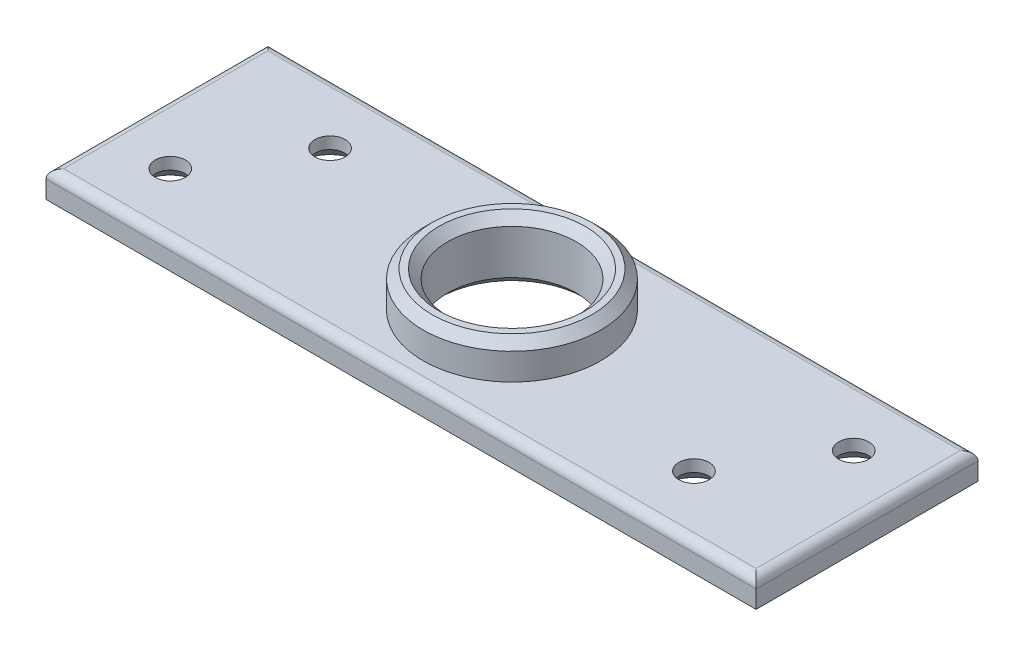
ISO-10303-21;
HEADER;
FILE_DESCRIPTION(('STEP AP214'),'2;1');
FILE_NAME('part.step','',(''),(''),'','','');
FILE_SCHEMA(('AUTOMOTIVE_DESIGN { 1 0 10303 214 1 1 1 1 }'));
ENDSEC;
DATA;
#1=APPLICATION_CONTEXT('core data for automotive mechanical design processes');
#2=APPLICATION_PROTOCOL_DEFINITION('international standard','automotive_design',2000,#1);
#3=PRODUCT_CONTEXT('',#1,'mechanical');
#4=PRODUCT('Part','Part','',(#3));
#5=PRODUCT_RELATED_PRODUCT_CATEGORY('part','',(#4));
#6=PRODUCT_DEFINITION_FORMATION('','',#4);
#7=PRODUCT_DEFINITION_CONTEXT('part definition',#1,'design');
#8=PRODUCT_DEFINITION('design','',#6,#7);
#9=PRODUCT_DEFINITION_SHAPE('','',#8);
#10=(LENGTH_UNIT() NAMED_UNIT(*) SI_UNIT(.MILLI.,.METRE.));
#11=(NAMED_UNIT(*) PLANE_ANGLE_UNIT() SI_UNIT($,.RADIAN.));
#12=(NAMED_UNIT(*) SI_UNIT($,.STERADIAN.) SOLID_ANGLE_UNIT());
#13=UNCERTAINTY_MEASURE_WITH_UNIT(LENGTH_MEASURE(1.E-05),#10,'distance_accuracy_value','');
#14=(GEOMETRIC_REPRESENTATION_CONTEXT(3) GLOBAL_UNCERTAINTY_ASSIGNED_CONTEXT((#13)) GLOBAL_UNIT_ASSIGNED_CONTEXT((#10,
#11,#12)) REPRESENTATION_CONTEXT('',''));
#15=CARTESIAN_POINT('',(0.,0.,0.));
#16=DIRECTION('',(0.,0.,1.));
#17=DIRECTION('',(1.,0.,0.));
#18=AXIS2_PLACEMENT_3D('',#15,#16,#17);
#19=CARTESIAN_POINT('',(0.,37.7842712474619,0.));
#20=DIRECTION('',(0.,-1.,0.));
#21=DIRECTION('',(0.,0.,-1.));
#22=AXIS2_PLACEMENT_3D('',#19,#20,#21);
#23=CYLINDRICAL_SURFACE('',#22,10.);
#24=CARTESIAN_POINT('',(0.,4.5,0.));
#25=DIRECTION('',(0.,-1.,0.));
#26=DIRECTION('',(0.,0.,-1.));
#27=AXIS2_PLACEMENT_3D('',#24,#25,#26);
#28=CIRCLE('',#27,10.);
#29=CARTESIAN_POINT('',(0.,4.5,-10.));
#30=VERTEX_POINT('',#29);
#31=EDGE_CURVE('E62',#30,#30,#28,.T.);
#32=ORIENTED_EDGE('',*,*,#31,.T.);
#33=EDGE_LOOP('',(#32));
#34=FACE_BOUND('',#33,.T.);
#35=CARTESIAN_POINT('',(0.,-0.5,0.));
#36=DIRECTION('',(0.,-1.,0.));
#37=DIRECTION('',(0.,0.,-1.));
#38=AXIS2_PLACEMENT_3D('',#35,#36,#37);
#39=CIRCLE('',#38,10.);
#40=CARTESIAN_POINT('',(0.,-0.5,-10.));
#41=VERTEX_POINT('',#40);
#42=EDGE_CURVE('E66',#41,#41,#39,.F.);
#43=ORIENTED_EDGE('',*,*,#42,.T.);
#44=EDGE_LOOP('',(#43));
#45=FACE_BOUND('',#44,.T.);
#46=ADVANCED_FACE('F50',(#34,#45),#23,.T.);
#47=CARTESIAN_POINT('',(0.,-1.5,0.));
#48=DIRECTION('',(0.,-1.,0.));
#49=DIRECTION('',(0.,0.,-1.));
#50=AXIS2_PLACEMENT_3D('',#47,#48,#49);
#51=PLANE('',#50);
#52=CARTESIAN_POINT('',(0.,-1.5,0.));
#53=DIRECTION('',(0.,-1.,0.));
#54=DIRECTION('',(0.,0.,-1.));
#55=AXIS2_PLACEMENT_3D('',#52,#53,#54);
#56=CIRCLE('',#55,9.00000000000001);
#57=CARTESIAN_POINT('',(0.,-1.5,-9.00000000000001));
#58=VERTEX_POINT('',#57);
#59=EDGE_CURVE('E11',#58,#58,#56,.T.);
#60=ORIENTED_EDGE('',*,*,#59,.T.);
#61=EDGE_LOOP('',(#60));
#62=FACE_BOUND('',#61,.T.);
#63=CARTESIAN_POINT('',(0.,-1.5,0.));
#64=DIRECTION('',(0.,-1.,0.));
#65=DIRECTION('',(0.,0.,-1.));
#66=AXIS2_PLACEMENT_3D('',#63,#64,#65);
#67=CIRCLE('',#66,8.24999999999999);
#68=CARTESIAN_POINT('',(0.,-1.5,-8.24999999999999));
#69=VERTEX_POINT('',#68);
#70=EDGE_CURVE('E58',#69,#69,#67,.F.);
#71=ORIENTED_EDGE('',*,*,#70,.T.);
#72=EDGE_LOOP('',(#71));
#73=FACE_BOUND('',#72,.T.);
#74=ADVANCED_FACE('F95',(#62,#73),#51,.T.);
#75=CARTESIAN_POINT('',(0.,37.7842712474619,0.));
#76=DIRECTION('',(0.,-1.,0.));
#77=DIRECTION('',(0.,0.,-1.));
#78=AXIS2_PLACEMENT_3D('',#75,#76,#77);
#79=CYLINDRICAL_SURFACE('',#78,7.25);
#80=CARTESIAN_POINT('',(0.,4.5,0.));
#81=DIRECTION('',(0.,-1.,0.));
#82=DIRECTION('',(0.,0.,-1.));
#83=AXIS2_PLACEMENT_3D('',#80,#81,#82);
#84=CIRCLE('',#83,7.25);
#85=CARTESIAN_POINT('',(0.,4.5,-7.25));
#86=VERTEX_POINT('',#85);
#87=EDGE_CURVE('E77',#86,#86,#84,.F.);
#88=ORIENTED_EDGE('',*,*,#87,.T.);
#89=EDGE_LOOP('',(#88));
#90=FACE_BOUND('',#89,.T.);
#91=CARTESIAN_POINT('',(0.,-0.500000000000014,0.));
#92=DIRECTION('',(0.,-1.,0.));
#93=DIRECTION('',(0.,0.,-1.));
#94=AXIS2_PLACEMENT_3D('',#91,#92,#93);
#95=CIRCLE('',#94,7.25);
#96=CARTESIAN_POINT('',(0.,-0.500000000000014,-7.25));
#97=VERTEX_POINT('',#96);
#98=EDGE_CURVE('E80',#97,#97,#95,.T.);
#99=ORIENTED_EDGE('',*,*,#98,.T.);
#100=EDGE_LOOP('',(#99));
#101=FACE_BOUND('',#100,.T.);
#102=ADVANCED_FACE('F84',(#90,#101),#79,.F.);
#103=CARTESIAN_POINT('',(0.,5.5,0.));
#104=DIRECTION('',(0.,-1.,0.));
#105=DIRECTION('',(0.,0.,-1.));
#106=AXIS2_PLACEMENT_3D('',#103,#104,#105);
#107=PLANE('',#106);
#108=CARTESIAN_POINT('',(0.,5.5,0.));
#109=DIRECTION('',(0.,-1.,0.));
#110=DIRECTION('',(0.,0.,-1.));
#111=AXIS2_PLACEMENT_3D('',#108,#109,#110);
#112=CIRCLE('',#111,8.25000000000001);
#113=CARTESIAN_POINT('',(0.,5.5,-8.25000000000001));
#114=VERTEX_POINT('',#113);
#115=EDGE_CURVE('E71',#114,#114,#112,.T.);
#116=ORIENTED_EDGE('',*,*,#115,.T.);
#117=EDGE_LOOP('',(#116));
#118=FACE_BOUND('',#117,.T.);
#119=CARTESIAN_POINT('',(0.,5.5,0.));
#120=DIRECTION('',(0.,-1.,0.));
#121=DIRECTION('',(0.,0.,-1.));
#122=AXIS2_PLACEMENT_3D('',#119,#120,#121);
#123=CIRCLE('',#122,9.);
#124=CARTESIAN_POINT('',(0.,5.5,-9.));
#125=VERTEX_POINT('',#124);
#126=EDGE_CURVE('E74',#125,#125,#123,.F.);
#127=ORIENTED_EDGE('',*,*,#126,.T.);
#128=EDGE_LOOP('',(#127));
#129=FACE_BOUND('',#128,.T.);
#130=ADVANCED_FACE('F112',(#118,#129),#107,.F.);
#131=CARTESIAN_POINT('',(0.,4.5,0.));
#132=DIRECTION('',(0.,1.,0.));
#133=DIRECTION('',(0.,0.,1.));
#134=AXIS2_PLACEMENT_3D('',#131,#132,#133);
#135=CONICAL_SURFACE('',#134,7.25,0.785398163397451);
#136=ORIENTED_EDGE('',*,*,#115,.F.);
#137=EDGE_LOOP('',(#136));
#138=FACE_BOUND('',#137,.T.);
#139=ORIENTED_EDGE('',*,*,#87,.F.);
#140=EDGE_LOOP('',(#139));
#141=FACE_BOUND('',#140,.T.);
#142=ADVANCED_FACE('F106',(#138,#141),#135,.F.);
#143=CARTESIAN_POINT('',(0.,5.5,0.));
#144=DIRECTION('',(0.,-1.,0.));
#145=DIRECTION('',(0.,0.,-1.));
#146=AXIS2_PLACEMENT_3D('',#143,#144,#145);
#147=CONICAL_SURFACE('',#146,9.00000000000001,0.785398163397446);
#148=ORIENTED_EDGE('',*,*,#31,.F.);
#149=EDGE_LOOP('',(#148));
#150=FACE_BOUND('',#149,.T.);
#151=ORIENTED_EDGE('',*,*,#126,.F.);
#152=EDGE_LOOP('',(#151));
#153=FACE_BOUND('',#152,.T.);
#154=ADVANCED_FACE('F92',(#150,#153),#147,.T.);
#155=CARTESIAN_POINT('',(0.,-1.5,0.));
#156=DIRECTION('',(0.,1.,0.));
#157=DIRECTION('',(0.,0.,1.));
#158=AXIS2_PLACEMENT_3D('',#155,#156,#157);
#159=CONICAL_SURFACE('',#158,9.00000000000001,0.785398163397446);
#160=ORIENTED_EDGE('',*,*,#42,.F.);
#161=EDGE_LOOP('',(#160));
#162=FACE_BOUND('',#161,.T.);
#163=ORIENTED_EDGE('',*,*,#59,.F.);
#164=EDGE_LOOP('',(#163));
#165=FACE_BOUND('',#164,.T.);
#166=ADVANCED_FACE('F87',(#162,#165),#159,.T.);
#167=CARTESIAN_POINT('',(0.,-0.500000000000014,0.));
#168=DIRECTION('',(0.,-1.,0.));
#169=DIRECTION('',(0.,0.,-1.));
#170=AXIS2_PLACEMENT_3D('',#167,#168,#169);
#171=CONICAL_SURFACE('',#170,7.25,0.78539816339745);
#172=ORIENTED_EDGE('',*,*,#70,.F.);
#173=EDGE_LOOP('',(#172));
#174=FACE_BOUND('',#173,.T.);
#175=ORIENTED_EDGE('',*,*,#98,.F.);
#176=EDGE_LOOP('',(#175));
#177=FACE_BOUND('',#176,.T.);
#178=ADVANCED_FACE('F53',(#174,#177),#171,.F.);
#179=CLOSED_SHELL('',(#46,#74,#102,#130,#142,#154,#166,#178));
#180=MANIFOLD_SOLID_BREP('B2',#179);
#181=CARTESIAN_POINT('',(0.,1.5,0.));
#182=DIRECTION('',(0.,-1.,0.));
#183=DIRECTION('',(0.,0.,-1.));
#184=AXIS2_PLACEMENT_3D('',#181,#182,#183);
#185=PLANE('',#184);
#186=CARTESIAN_POINT('',(32.9999999999999,1.5,-5.50000000000353));
#187=DIRECTION('',(0.,-1.,0.));
#188=DIRECTION('',(0.,0.,-1.));
#189=AXIS2_PLACEMENT_3D('',#186,#187,#188);
#190=CIRCLE('',#189,1.7);
#191=CARTESIAN_POINT('',(32.9999999999999,1.5,-7.20000000000353));
#192=VERTEX_POINT('',#191);
#193=EDGE_CURVE('E204',#192,#192,#190,.T.);
#194=ORIENTED_EDGE('',*,*,#193,.T.);
#195=EDGE_LOOP('',(#194));
#196=FACE_BOUND('',#195,.T.);
#197=CARTESIAN_POINT('',(25.9999999999999,1.5,5.49999999999647));
#198=DIRECTION('',(0.,-1.,0.));
#199=DIRECTION('',(0.,0.,-1.));
#200=AXIS2_PLACEMENT_3D('',#197,#198,#199);
#201=CIRCLE('',#200,1.7);
#202=CARTESIAN_POINT('',(25.9999999999999,1.5,3.79999999999647));
#203=VERTEX_POINT('',#202);
#204=EDGE_CURVE('E318',#203,#203,#201,.T.);
#205=ORIENTED_EDGE('',*,*,#204,.T.);
#206=EDGE_LOOP('',(#205));
#207=FACE_BOUND('',#206,.T.);
#208=CARTESIAN_POINT('',(-26.0000000000001,1.5,-5.50000000000354));
#209=DIRECTION('',(0.,-1.,0.));
#210=DIRECTION('',(0.,0.,-1.));
#211=AXIS2_PLACEMENT_3D('',#208,#209,#210);
#212=CIRCLE('',#211,1.7);
#213=CARTESIAN_POINT('',(-26.0000000000001,1.5,-7.20000000000354));
#214=VERTEX_POINT('',#213);
#215=EDGE_CURVE('E314',#214,#214,#212,.T.);
#216=ORIENTED_EDGE('',*,*,#215,.T.);
#217=EDGE_LOOP('',(#216));
#218=FACE_BOUND('',#217,.T.);
#219=CARTESIAN_POINT('',(-33.0000000000001,1.5,5.49999999999645));
#220=DIRECTION('',(0.,-1.,0.));
#221=DIRECTION('',(0.,0.,-1.));
#222=AXIS2_PLACEMENT_3D('',#219,#220,#221);
#223=CIRCLE('',#222,1.7);
#224=CARTESIAN_POINT('',(-33.0000000000001,1.5,3.79999999999645));
#225=VERTEX_POINT('',#224);
#226=EDGE_CURVE('E303',#225,#225,#223,.T.);
#227=ORIENTED_EDGE('',*,*,#226,.T.);
#228=EDGE_LOOP('',(#227));
#229=FACE_BOUND('',#228,.T.);
#230=DIRECTION('',(-1.,0.,0.));
#231=VECTOR('',#230,1.);
#232=CARTESIAN_POINT('',(0.,1.5,-11.5));
#233=LINE('',#232,#231);
#234=CARTESIAN_POINT('',(39.,1.5,-11.5));
#235=VERTEX_POINT('',#234);
#236=CARTESIAN_POINT('',(-39.,1.5,-11.5));
#237=VERTEX_POINT('',#236);
#238=EDGE_CURVE('E290',#235,#237,#233,.T.);
#239=ORIENTED_EDGE('',*,*,#238,.T.);
#240=DIRECTION('',(0.,0.,1.));
#241=VECTOR('',#240,1.);
#242=CARTESIAN_POINT('',(-39.,1.5,0.));
#243=LINE('',#242,#241);
#244=CARTESIAN_POINT('',(-39.,1.5,11.5));
#245=VERTEX_POINT('',#244);
#246=EDGE_CURVE('E292',#237,#245,#243,.T.);
#247=ORIENTED_EDGE('',*,*,#246,.T.);
#248=DIRECTION('',(1.,0.,0.));
#249=VECTOR('',#248,1.);
#250=CARTESIAN_POINT('',(0.,1.5,11.5));
#251=LINE('',#250,#249);
#252=CARTESIAN_POINT('',(39.,1.5,11.5));
#253=VERTEX_POINT('',#252);
#254=EDGE_CURVE('E258',#245,#253,#251,.T.);
#255=ORIENTED_EDGE('',*,*,#254,.T.);
#256=DIRECTION('',(0.,0.,-1.));
#257=VECTOR('',#256,1.);
#258=CARTESIAN_POINT('',(39.,1.5,0.));
#259=LINE('',#258,#257);
#260=EDGE_CURVE('E288',#253,#235,#259,.T.);
#261=ORIENTED_EDGE('',*,*,#260,.T.);
#262=EDGE_LOOP('',(#239,#247,#255,#261));
#263=FACE_BOUND('',#262,.T.);
#264=CARTESIAN_POINT('',(0.,1.5,0.));
#265=DIRECTION('',(0.,1.,0.));
#266=DIRECTION('',(0.,0.,1.));
#267=AXIS2_PLACEMENT_3D('',#264,#265,#266);
#268=CIRCLE('',#267,10.);
#269=CARTESIAN_POINT('',(0.,1.5,10.));
#270=VERTEX_POINT('',#269);
#271=EDGE_CURVE('E273',#270,#270,#268,.T.);
#272=ORIENTED_EDGE('',*,*,#271,.F.);
#273=EDGE_LOOP('',(#272));
#274=FACE_BOUND('',#273,.T.);
#275=ADVANCED_FACE('F200',(#196,#207,#218,#229,#263,#274),#185,.F.);
#276=CARTESIAN_POINT('',(0.,-1.5,0.));
#277=DIRECTION('',(0.,-1.,0.));
#278=DIRECTION('',(0.,0.,-1.));
#279=AXIS2_PLACEMENT_3D('',#276,#277,#278);
#280=PLANE('',#279);
#281=CARTESIAN_POINT('',(32.9999999999999,-1.5,-5.50000000000353));
#282=DIRECTION('',(0.,-1.,0.));
#283=DIRECTION('',(0.,0.,-1.));
#284=AXIS2_PLACEMENT_3D('',#281,#282,#283);
#285=CIRCLE('',#284,3.36);
#286=CARTESIAN_POINT('',(32.9999999999999,-1.5,-8.86000000000353));
#287=VERTEX_POINT('',#286);
#288=EDGE_CURVE('E443',#287,#287,#285,.T.);
#289=ORIENTED_EDGE('',*,*,#288,.F.);
#290=EDGE_LOOP('',(#289));
#291=FACE_BOUND('',#290,.T.);
#292=CARTESIAN_POINT('',(25.9999999999999,-1.5,5.49999999999647));
#293=DIRECTION('',(0.,-1.,0.));
#294=DIRECTION('',(0.,0.,-1.));
#295=AXIS2_PLACEMENT_3D('',#292,#293,#294);
#296=CIRCLE('',#295,3.36);
#297=CARTESIAN_POINT('',(25.9999999999999,-1.5,2.13999999999647));
#298=VERTEX_POINT('',#297);
#299=EDGE_CURVE('E327',#298,#298,#296,.T.);
#300=ORIENTED_EDGE('',*,*,#299,.F.);
#301=EDGE_LOOP('',(#300));
#302=FACE_BOUND('',#301,.T.);
#303=CARTESIAN_POINT('',(-26.0000000000001,-1.5,-5.50000000000354));
#304=DIRECTION('',(0.,-1.,0.));
#305=DIRECTION('',(0.,0.,-1.));
#306=AXIS2_PLACEMENT_3D('',#303,#304,#305);
#307=CIRCLE('',#306,3.36);
#308=CARTESIAN_POINT('',(-26.0000000000001,-1.5,-8.86000000000355));
#309=VERTEX_POINT('',#308);
#310=EDGE_CURVE('E320',#309,#309,#307,.T.);
#311=ORIENTED_EDGE('',*,*,#310,.F.);
#312=EDGE_LOOP('',(#311));
#313=FACE_BOUND('',#312,.T.);
#314=CARTESIAN_POINT('',(-33.0000000000001,-1.5,5.49999999999645));
#315=DIRECTION('',(0.,-1.,0.));
#316=DIRECTION('',(0.,0.,-1.));
#317=AXIS2_PLACEMENT_3D('',#314,#315,#316);
#318=CIRCLE('',#317,3.36);
#319=CARTESIAN_POINT('',(-33.0000000000001,-1.5,2.13999999999645));
#320=VERTEX_POINT('',#319);
#321=EDGE_CURVE('E316',#320,#320,#318,.T.);
#322=ORIENTED_EDGE('',*,*,#321,.F.);
#323=EDGE_LOOP('',(#322));
#324=FACE_BOUND('',#323,.T.);
#325=DIRECTION('',(0.,0.,-1.));
#326=VECTOR('',#325,1.);
#327=CARTESIAN_POINT('',(40.,-1.5,12.5));
#328=LINE('',#327,#326);
#329=CARTESIAN_POINT('',(40.,-1.5,12.5));
#330=VERTEX_POINT('',#329);
#331=CARTESIAN_POINT('',(40.,-1.5,-12.5));
#332=VERTEX_POINT('',#331);
#333=EDGE_CURVE('E266',#330,#332,#328,.T.);
#334=ORIENTED_EDGE('',*,*,#333,.F.);
#335=DIRECTION('',(1.,0.,0.));
#336=VECTOR('',#335,1.);
#337=CARTESIAN_POINT('',(-40.,-1.5,12.5));
#338=LINE('',#337,#336);
#339=CARTESIAN_POINT('',(-40.,-1.5,12.5));
#340=VERTEX_POINT('',#339);
#341=EDGE_CURVE('E281',#340,#330,#338,.T.);
#342=ORIENTED_EDGE('',*,*,#341,.F.);
#343=DIRECTION('',(0.,0.,1.));
#344=VECTOR('',#343,1.);
#345=CARTESIAN_POINT('',(-40.,-1.5,12.5));
#346=LINE('',#345,#344);
#347=CARTESIAN_POINT('',(-40.,-1.5,-12.5));
#348=VERTEX_POINT('',#347);
#349=EDGE_CURVE('E268',#348,#340,#346,.T.);
#350=ORIENTED_EDGE('',*,*,#349,.F.);
#351=DIRECTION('',(-1.,0.,0.));
#352=VECTOR('',#351,1.);
#353=CARTESIAN_POINT('',(-40.,-1.5,-12.5));
#354=LINE('',#353,#352);
#355=EDGE_CURVE('E255',#332,#348,#354,.T.);
#356=ORIENTED_EDGE('',*,*,#355,.F.);
#357=EDGE_LOOP('',(#334,#342,#350,#356));
#358=FACE_BOUND('',#357,.T.);
#359=CARTESIAN_POINT('',(0.,-1.5,0.));
#360=DIRECTION('',(0.,1.,0.));
#361=DIRECTION('',(0.,0.,1.));
#362=AXIS2_PLACEMENT_3D('',#359,#360,#361);
#363=CIRCLE('',#362,10.);
#364=CARTESIAN_POINT('',(0.,-1.5,10.));
#365=VERTEX_POINT('',#364);
#366=EDGE_CURVE('E276',#365,#365,#363,.T.);
#367=ORIENTED_EDGE('',*,*,#366,.T.);
#368=EDGE_LOOP('',(#367));
#369=FACE_BOUND('',#368,.T.);
#370=ADVANCED_FACE('F263',(#291,#302,#313,#324,#358,#369),#280,.T.);
#371=CARTESIAN_POINT('',(40.,1.5,12.5));
#372=DIRECTION('',(-1.,0.,0.));
#373=DIRECTION('',(0.,0.,1.));
#374=AXIS2_PLACEMENT_3D('',#371,#372,#373);
#375=PLANE('',#374);
#376=DIRECTION('',(0.,-1.,0.));
#377=VECTOR('',#376,1.);
#378=CARTESIAN_POINT('',(40.,1.5,-12.5));
#379=LINE('',#378,#377);
#380=CARTESIAN_POINT('',(40.,0.5,-12.5));
#381=VERTEX_POINT('',#380);
#382=EDGE_CURVE('E252',#381,#332,#379,.T.);
#383=ORIENTED_EDGE('',*,*,#382,.F.);
#384=DIRECTION('',(0.,0.,-1.));
#385=VECTOR('',#384,1.);
#386=CARTESIAN_POINT('',(40.,0.5,12.5));
#387=LINE('',#386,#385);
#388=CARTESIAN_POINT('',(40.,0.5,12.5));
#389=VERTEX_POINT('',#388);
#390=EDGE_CURVE('E209',#381,#389,#387,.F.);
#391=ORIENTED_EDGE('',*,*,#390,.T.);
#392=DIRECTION('',(0.,-1.,0.));
#393=VECTOR('',#392,1.);
#394=CARTESIAN_POINT('',(40.,1.5,12.5));
#395=LINE('',#394,#393);
#396=EDGE_CURVE('E271',#389,#330,#395,.T.);
#397=ORIENTED_EDGE('',*,*,#396,.T.);
#398=ORIENTED_EDGE('',*,*,#333,.T.);
#399=EDGE_LOOP('',(#383,#391,#397,#398));
#400=FACE_BOUND('',#399,.T.);
#401=ADVANCED_FACE('F270',(#400),#375,.F.);
#402=CARTESIAN_POINT('',(-40.,1.5,-12.5));
#403=DIRECTION('',(0.,0.,1.));
#404=DIRECTION('',(1.,0.,0.));
#405=AXIS2_PLACEMENT_3D('',#402,#403,#404);
#406=PLANE('',#405);
#407=DIRECTION('',(0.,-1.,0.));
#408=VECTOR('',#407,1.);
#409=CARTESIAN_POINT('',(-40.,1.5,-12.5));
#410=LINE('',#409,#408);
#411=CARTESIAN_POINT('',(-40.,0.5,-12.5));
#412=VERTEX_POINT('',#411);
#413=EDGE_CURVE('E259',#412,#348,#410,.T.);
#414=ORIENTED_EDGE('',*,*,#413,.F.);
#415=DIRECTION('',(-1.,0.,0.));
#416=VECTOR('',#415,1.);
#417=CARTESIAN_POINT('',(-40.,0.5,-12.5));
#418=LINE('',#417,#416);
#419=EDGE_CURVE('E224',#412,#381,#418,.F.);
#420=ORIENTED_EDGE('',*,*,#419,.T.);
#421=ORIENTED_EDGE('',*,*,#382,.T.);
#422=ORIENTED_EDGE('',*,*,#355,.T.);
#423=EDGE_LOOP('',(#414,#420,#421,#422));
#424=FACE_BOUND('',#423,.T.);
#425=ADVANCED_FACE('F254',(#424),#406,.F.);
#426=CARTESIAN_POINT('',(-40.,1.5,12.5));
#427=DIRECTION('',(1.,0.,0.));
#428=DIRECTION('',(0.,0.,-1.));
#429=AXIS2_PLACEMENT_3D('',#426,#427,#428);
#430=PLANE('',#429);
#431=DIRECTION('',(0.,-1.,0.));
#432=VECTOR('',#431,1.);
#433=CARTESIAN_POINT('',(-40.,1.5,12.5));
#434=LINE('',#433,#432);
#435=CARTESIAN_POINT('',(-40.,0.5,12.5));
#436=VERTEX_POINT('',#435);
#437=EDGE_CURVE('E284',#436,#340,#434,.T.);
#438=ORIENTED_EDGE('',*,*,#437,.F.);
#439=DIRECTION('',(0.,0.,1.));
#440=VECTOR('',#439,1.);
#441=CARTESIAN_POINT('',(-40.,0.5,12.5));
#442=LINE('',#441,#440);
#443=EDGE_CURVE('E295',#436,#412,#442,.F.);
#444=ORIENTED_EDGE('',*,*,#443,.T.);
#445=ORIENTED_EDGE('',*,*,#413,.T.);
#446=ORIENTED_EDGE('',*,*,#349,.T.);
#447=EDGE_LOOP('',(#438,#444,#445,#446));
#448=FACE_BOUND('',#447,.T.);
#449=ADVANCED_FACE('F370',(#448),#430,.F.);
#450=CARTESIAN_POINT('',(-40.,1.5,12.5));
#451=DIRECTION('',(0.,0.,-1.));
#452=DIRECTION('',(-1.,0.,0.));
#453=AXIS2_PLACEMENT_3D('',#450,#451,#452);
#454=PLANE('',#453);
#455=ORIENTED_EDGE('',*,*,#396,.F.);
#456=DIRECTION('',(1.,0.,0.));
#457=VECTOR('',#456,1.);
#458=CARTESIAN_POINT('',(-40.,0.5,12.5));
#459=LINE('',#458,#457);
#460=EDGE_CURVE('E48',#389,#436,#459,.F.);
#461=ORIENTED_EDGE('',*,*,#460,.T.);
#462=ORIENTED_EDGE('',*,*,#437,.T.);
#463=ORIENTED_EDGE('',*,*,#341,.T.);
#464=EDGE_LOOP('',(#455,#461,#462,#463));
#465=FACE_BOUND('',#464,.T.);
#466=ADVANCED_FACE('F366',(#465),#454,.F.);
#467=CARTESIAN_POINT('',(0.,1.5,0.));
#468=DIRECTION('',(0.,-1.,0.));
#469=DIRECTION('',(0.,0.,-1.));
#470=AXIS2_PLACEMENT_3D('',#467,#468,#469);
#471=CYLINDRICAL_SURFACE('',#470,10.);
#472=ORIENTED_EDGE('',*,*,#271,.T.);
#473=EDGE_LOOP('',(#472));
#474=FACE_BOUND('',#473,.T.);
#475=ORIENTED_EDGE('',*,*,#366,.F.);
#476=EDGE_LOOP('',(#475));
#477=FACE_BOUND('',#476,.T.);
#478=ADVANCED_FACE('F369',(#474,#477),#471,.F.);
#479=CARTESIAN_POINT('',(39.,0.5,0.));
#480=DIRECTION('',(0.,0.,-1.));
#481=DIRECTION('',(-1.,0.,0.));
#482=AXIS2_PLACEMENT_3D('',#479,#480,#481);
#483=CYLINDRICAL_SURFACE('',#482,1.);
#484=CARTESIAN_POINT('',(39.,0.5,11.5));
#485=DIRECTION('',(0.707106781186547,0.,-0.707106781186547));
#486=DIRECTION('',(0.707106781186547,0.,0.707106781186547));
#487=AXIS2_PLACEMENT_3D('',#484,#485,#486);
#488=ELLIPSE('',#487,1.41421356237309,1.);
#489=EDGE_CURVE('E305',#389,#253,#488,.F.);
#490=ORIENTED_EDGE('',*,*,#489,.F.);
#491=ORIENTED_EDGE('',*,*,#390,.F.);
#492=CARTESIAN_POINT('',(39.,0.5,-11.5));
#493=DIRECTION('',(-0.707106781186547,0.,-0.707106781186547));
#494=DIRECTION('',(0.707106781186547,0.,-0.707106781186547));
#495=AXIS2_PLACEMENT_3D('',#492,#493,#494);
#496=ELLIPSE('',#495,1.41421356237309,1.);
#497=EDGE_CURVE('E308',#235,#381,#496,.T.);
#498=ORIENTED_EDGE('',*,*,#497,.F.);
#499=ORIENTED_EDGE('',*,*,#260,.F.);
#500=EDGE_LOOP('',(#490,#491,#498,#499));
#501=FACE_BOUND('',#500,.T.);
#502=ADVANCED_FACE('F202',(#501),#483,.T.);
#503=CARTESIAN_POINT('',(0.,0.5,-11.5));
#504=DIRECTION('',(-1.,0.,0.));
#505=DIRECTION('',(0.,0.,1.));
#506=AXIS2_PLACEMENT_3D('',#503,#504,#505);
#507=CYLINDRICAL_SURFACE('',#506,1.);
#508=ORIENTED_EDGE('',*,*,#497,.T.);
#509=ORIENTED_EDGE('',*,*,#419,.F.);
#510=CARTESIAN_POINT('',(-39.,0.5,-11.5));
#511=DIRECTION('',(-0.707106781186547,0.,0.707106781186547));
#512=DIRECTION('',(-0.707106781186547,0.,-0.707106781186547));
#513=AXIS2_PLACEMENT_3D('',#510,#511,#512);
#514=ELLIPSE('',#513,1.41421356237309,1.);
#515=EDGE_CURVE('E302',#237,#412,#514,.T.);
#516=ORIENTED_EDGE('',*,*,#515,.F.);
#517=ORIENTED_EDGE('',*,*,#238,.F.);
#518=EDGE_LOOP('',(#508,#509,#516,#517));
#519=FACE_BOUND('',#518,.T.);
#520=ADVANCED_FACE('F383',(#519),#507,.T.);
#521=CARTESIAN_POINT('',(0.,0.5,11.5));
#522=DIRECTION('',(1.,0.,0.));
#523=DIRECTION('',(0.,0.,-1.));
#524=AXIS2_PLACEMENT_3D('',#521,#522,#523);
#525=CYLINDRICAL_SURFACE('',#524,1.);
#526=ORIENTED_EDGE('',*,*,#489,.T.);
#527=ORIENTED_EDGE('',*,*,#254,.F.);
#528=CARTESIAN_POINT('',(-39.,0.5,11.5));
#529=DIRECTION('',(0.707106781186547,0.,0.707106781186547));
#530=DIRECTION('',(0.707106781186547,0.,-0.707106781186547));
#531=AXIS2_PLACEMENT_3D('',#528,#529,#530);
#532=ELLIPSE('',#531,1.41421356237309,1.);
#533=EDGE_CURVE('E300',#436,#245,#532,.F.);
#534=ORIENTED_EDGE('',*,*,#533,.F.);
#535=ORIENTED_EDGE('',*,*,#460,.F.);
#536=EDGE_LOOP('',(#526,#527,#534,#535));
#537=FACE_BOUND('',#536,.T.);
#538=ADVANCED_FACE('F380',(#537),#525,.T.);
#539=CARTESIAN_POINT('',(-39.,0.5,0.));
#540=DIRECTION('',(0.,0.,1.));
#541=DIRECTION('',(1.,0.,0.));
#542=AXIS2_PLACEMENT_3D('',#539,#540,#541);
#543=CYLINDRICAL_SURFACE('',#542,1.);
#544=ORIENTED_EDGE('',*,*,#515,.T.);
#545=ORIENTED_EDGE('',*,*,#443,.F.);
#546=ORIENTED_EDGE('',*,*,#533,.T.);
#547=ORIENTED_EDGE('',*,*,#246,.F.);
#548=EDGE_LOOP('',(#544,#545,#546,#547));
#549=FACE_BOUND('',#548,.T.);
#550=ADVANCED_FACE('F377',(#549),#543,.T.);
#551=CARTESIAN_POINT('',(-33.0000000000001,-1.5,5.49999999999645));
#552=DIRECTION('',(0.,-1.,0.));
#553=DIRECTION('',(0.,0.,-1.));
#554=AXIS2_PLACEMENT_3D('',#551,#552,#553);
#555=CYLINDRICAL_SURFACE('',#554,1.7);
#556=CARTESIAN_POINT('',(-33.0000000000001,0.160000000000001,5.49999999999645));
#557=DIRECTION('',(0.,-1.,0.));
#558=DIRECTION('',(0.,0.,-1.));
#559=AXIS2_PLACEMENT_3D('',#556,#557,#558);
#560=CIRCLE('',#559,1.7);
#561=CARTESIAN_POINT('',(-33.0000000000001,0.160000000000001,3.79999999999645));
#562=VERTEX_POINT('',#561);
#563=EDGE_CURVE('E313',#562,#562,#560,.T.);
#564=ORIENTED_EDGE('',*,*,#563,.T.);
#565=EDGE_LOOP('',(#564));
#566=FACE_BOUND('',#565,.T.);
#567=ORIENTED_EDGE('',*,*,#226,.F.);
#568=EDGE_LOOP('',(#567));
#569=FACE_BOUND('',#568,.T.);
#570=ADVANCED_FACE('F342',(#566,#569),#555,.F.);
#571=CARTESIAN_POINT('',(-33.0000000000001,-1.5,5.49999999999645));
#572=DIRECTION('',(0.,-1.,0.));
#573=DIRECTION('',(0.,0.,-1.));
#574=AXIS2_PLACEMENT_3D('',#571,#572,#573);
#575=CONICAL_SURFACE('',#574,3.36,0.785398163397448);
#576=ORIENTED_EDGE('',*,*,#563,.F.);
#577=EDGE_LOOP('',(#576));
#578=FACE_BOUND('',#577,.T.);
#579=ORIENTED_EDGE('',*,*,#321,.T.);
#580=EDGE_LOOP('',(#579));
#581=FACE_BOUND('',#580,.T.);
#582=ADVANCED_FACE('F345',(#578,#581),#575,.F.);
#583=CARTESIAN_POINT('',(-26.0000000000001,-1.5,-5.50000000000354));
#584=DIRECTION('',(0.,-1.,0.));
#585=DIRECTION('',(0.,0.,-1.));
#586=AXIS2_PLACEMENT_3D('',#583,#584,#585);
#587=CYLINDRICAL_SURFACE('',#586,1.7);
#588=CARTESIAN_POINT('',(-26.0000000000001,0.160000000000001,-5.50000000000354));
#589=DIRECTION('',(0.,-1.,0.));
#590=DIRECTION('',(0.,0.,-1.));
#591=AXIS2_PLACEMENT_3D('',#588,#589,#590);
#592=CIRCLE('',#591,1.7);
#593=CARTESIAN_POINT('',(-26.0000000000001,0.160000000000001,-7.20000000000354));
#594=VERTEX_POINT('',#593);
#595=EDGE_CURVE('E317',#594,#594,#592,.T.);
#596=ORIENTED_EDGE('',*,*,#595,.T.);
#597=EDGE_LOOP('',(#596));
#598=FACE_BOUND('',#597,.T.);
#599=ORIENTED_EDGE('',*,*,#215,.F.);
#600=EDGE_LOOP('',(#599));
#601=FACE_BOUND('',#600,.T.);
#602=ADVANCED_FACE('F348',(#598,#601),#587,.F.);
#603=CARTESIAN_POINT('',(-26.0000000000001,-1.5,-5.50000000000354));
#604=DIRECTION('',(0.,-1.,0.));
#605=DIRECTION('',(0.,0.,-1.));
#606=AXIS2_PLACEMENT_3D('',#603,#604,#605);
#607=CONICAL_SURFACE('',#606,3.36,0.785398163397448);
#608=ORIENTED_EDGE('',*,*,#595,.F.);
#609=EDGE_LOOP('',(#608));
#610=FACE_BOUND('',#609,.T.);
#611=ORIENTED_EDGE('',*,*,#310,.T.);
#612=EDGE_LOOP('',(#611));
#613=FACE_BOUND('',#612,.T.);
#614=ADVANCED_FACE('F417',(#610,#613),#607,.F.);
#615=CARTESIAN_POINT('',(25.9999999999999,-1.5,5.49999999999647));
#616=DIRECTION('',(0.,-1.,0.));
#617=DIRECTION('',(0.,0.,-1.));
#618=AXIS2_PLACEMENT_3D('',#615,#616,#617);
#619=CYLINDRICAL_SURFACE('',#618,1.7);
#620=CARTESIAN_POINT('',(25.9999999999999,0.160000000000001,5.49999999999647));
#621=DIRECTION('',(0.,-1.,0.));
#622=DIRECTION('',(0.,0.,-1.));
#623=AXIS2_PLACEMENT_3D('',#620,#621,#622);
#624=CIRCLE('',#623,1.7);
#625=CARTESIAN_POINT('',(25.9999999999999,0.160000000000001,3.79999999999647));
#626=VERTEX_POINT('',#625);
#627=EDGE_CURVE('E321',#626,#626,#624,.T.);
#628=ORIENTED_EDGE('',*,*,#627,.T.);
#629=EDGE_LOOP('',(#628));
#630=FACE_BOUND('',#629,.T.);
#631=ORIENTED_EDGE('',*,*,#204,.F.);
#632=EDGE_LOOP('',(#631));
#633=FACE_BOUND('',#632,.T.);
#634=ADVANCED_FACE('F421',(#630,#633),#619,.F.);
#635=CARTESIAN_POINT('',(25.9999999999999,-1.5,5.49999999999647));
#636=DIRECTION('',(0.,-1.,0.));
#637=DIRECTION('',(0.,0.,-1.));
#638=AXIS2_PLACEMENT_3D('',#635,#636,#637);
#639=CONICAL_SURFACE('',#638,3.36,0.785398163397448);
#640=ORIENTED_EDGE('',*,*,#627,.F.);
#641=EDGE_LOOP('',(#640));
#642=FACE_BOUND('',#641,.T.);
#643=ORIENTED_EDGE('',*,*,#299,.T.);
#644=EDGE_LOOP('',(#643));
#645=FACE_BOUND('',#644,.T.);
#646=ADVANCED_FACE('F425',(#642,#645),#639,.F.);
#647=CARTESIAN_POINT('',(32.9999999999999,-1.5,-5.50000000000353));
#648=DIRECTION('',(0.,-1.,0.));
#649=DIRECTION('',(0.,0.,-1.));
#650=AXIS2_PLACEMENT_3D('',#647,#648,#649);
#651=CYLINDRICAL_SURFACE('',#650,1.7);
#652=CARTESIAN_POINT('',(32.9999999999999,0.160000000000001,-5.50000000000353));
#653=DIRECTION('',(0.,-1.,0.));
#654=DIRECTION('',(0.,0.,-1.));
#655=AXIS2_PLACEMENT_3D('',#652,#653,#654);
#656=CIRCLE('',#655,1.7);
#657=CARTESIAN_POINT('',(32.9999999999999,0.160000000000001,-7.20000000000353));
#658=VERTEX_POINT('',#657);
#659=EDGE_CURVE('E441',#658,#658,#656,.T.);
#660=ORIENTED_EDGE('',*,*,#659,.T.);
#661=EDGE_LOOP('',(#660));
#662=FACE_BOUND('',#661,.T.);
#663=ORIENTED_EDGE('',*,*,#193,.F.);
#664=EDGE_LOOP('',(#663));
#665=FACE_BOUND('',#664,.T.);
#666=ADVANCED_FACE('F428',(#662,#665),#651,.F.);
#667=CARTESIAN_POINT('',(32.9999999999999,-1.5,-5.50000000000353));
#668=DIRECTION('',(0.,-1.,0.));
#669=DIRECTION('',(0.,0.,-1.));
#670=AXIS2_PLACEMENT_3D('',#667,#668,#669);
#671=CONICAL_SURFACE('',#670,3.36,0.785398163397448);
#672=ORIENTED_EDGE('',*,*,#659,.F.);
#673=EDGE_LOOP('',(#672));
#674=FACE_BOUND('',#673,.T.);
#675=ORIENTED_EDGE('',*,*,#288,.T.);
#676=EDGE_LOOP('',(#675));
#677=FACE_BOUND('',#676,.T.);
#678=ADVANCED_FACE('F432',(#674,#677),#671,.F.);
#679=CLOSED_SHELL('',(#275,#370,#401,#425,#449,#466,#478,#502,#520,#538,#550,#570,#582,#602,
#614,#634,#646,#666,#678));
#680=MANIFOLD_SOLID_BREP('B6',#679);
#681=ADVANCED_BREP_SHAPE_REPRESENTATION('',(#18,#180,#680),#14);
#682=SHAPE_DEFINITION_REPRESENTATION(#9,#681);
ENDSEC;
END-ISO-10303-21;
